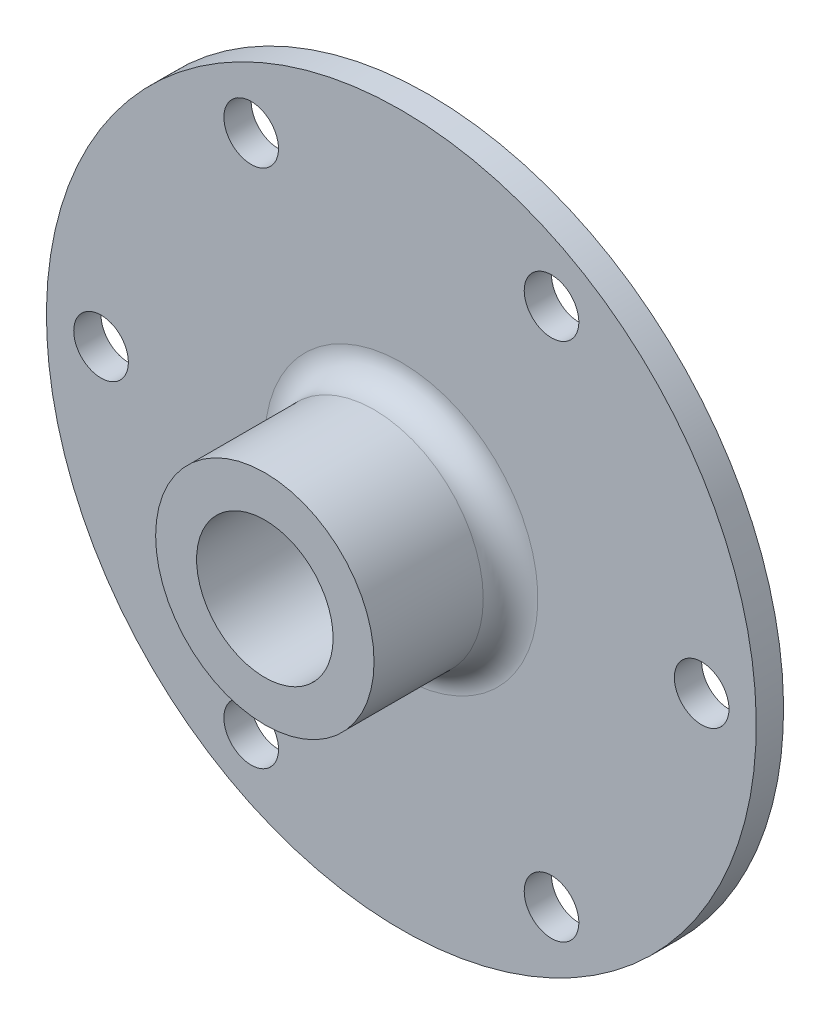
ISO-10303-21;
HEADER;
FILE_DESCRIPTION(('STEP AP214'),'2;1');
FILE_NAME('part.step','',(''),(''),'','','');
FILE_SCHEMA(('AUTOMOTIVE_DESIGN { 1 0 10303 214 1 1 1 1 }'));
ENDSEC;
DATA;
#1=APPLICATION_CONTEXT('core data for automotive mechanical design processes');
#2=APPLICATION_PROTOCOL_DEFINITION('international standard','automotive_design',2000,#1);
#3=PRODUCT_CONTEXT('',#1,'mechanical');
#4=PRODUCT('Part','Part','',(#3));
#5=PRODUCT_RELATED_PRODUCT_CATEGORY('part','',(#4));
#6=PRODUCT_DEFINITION_FORMATION('','',#4);
#7=PRODUCT_DEFINITION_CONTEXT('part definition',#1,'design');
#8=PRODUCT_DEFINITION('design','',#6,#7);
#9=PRODUCT_DEFINITION_SHAPE('','',#8);
#10=(LENGTH_UNIT() NAMED_UNIT(*) SI_UNIT(.MILLI.,.METRE.));
#11=(NAMED_UNIT(*) PLANE_ANGLE_UNIT() SI_UNIT($,.RADIAN.));
#12=(NAMED_UNIT(*) SI_UNIT($,.STERADIAN.) SOLID_ANGLE_UNIT());
#13=UNCERTAINTY_MEASURE_WITH_UNIT(LENGTH_MEASURE(1.E-05),#10,'distance_accuracy_value','');
#14=(GEOMETRIC_REPRESENTATION_CONTEXT(3) GLOBAL_UNCERTAINTY_ASSIGNED_CONTEXT((#13)) GLOBAL_UNIT_ASSIGNED_CONTEXT((#10,
#11,#12)) REPRESENTATION_CONTEXT('',''));
#15=CARTESIAN_POINT('',(0.,0.,0.));
#16=DIRECTION('',(0.,0.,1.));
#17=DIRECTION('',(1.,0.,0.));
#18=AXIS2_PLACEMENT_3D('',#15,#16,#17);
#19=CARTESIAN_POINT('',(0.,0.,19.05));
#20=DIRECTION('',(0.,0.,1.));
#21=DIRECTION('',(0.,-1.,0.));
#22=AXIS2_PLACEMENT_3D('',#19,#20,#21);
#23=PLANE('',#22);
#24=CARTESIAN_POINT('',(0.,0.,19.05));
#25=DIRECTION('',(0.,0.,1.));
#26=DIRECTION('',(1.,0.,0.));
#27=AXIS2_PLACEMENT_3D('',#24,#25,#26);
#28=CIRCLE('',#27,7.9375);
#29=CARTESIAN_POINT('',(7.9375,0.,19.05));
#30=VERTEX_POINT('',#29);
#31=EDGE_CURVE('E54',#30,#30,#28,.T.);
#32=ORIENTED_EDGE('',*,*,#31,.F.);
#33=EDGE_LOOP('',(#32));
#34=FACE_BOUND('',#33,.T.);
#35=CARTESIAN_POINT('',(0.,0.,19.05));
#36=DIRECTION('',(0.,0.,-1.));
#37=DIRECTION('',(0.,1.,0.));
#38=AXIS2_PLACEMENT_3D('',#35,#36,#37);
#39=CIRCLE('',#38,12.7);
#40=CARTESIAN_POINT('',(0.,12.7,19.05));
#41=VERTEX_POINT('',#40);
#42=EDGE_CURVE('E41',#41,#41,#39,.T.);
#43=ORIENTED_EDGE('',*,*,#42,.F.);
#44=EDGE_LOOP('',(#43));
#45=FACE_BOUND('',#44,.T.);
#46=ADVANCED_FACE('F30',(#34,#45),#23,.T.);
#47=CARTESIAN_POINT('',(0.,0.,0.));
#48=DIRECTION('',(0.,0.,-1.));
#49=DIRECTION('',(0.,1.,0.));
#50=AXIS2_PLACEMENT_3D('',#47,#48,#49);
#51=CYLINDRICAL_SURFACE('',#50,12.7);
#52=CARTESIAN_POINT('',(0.,0.,6.35));
#53=DIRECTION('',(0.,0.,1.));
#54=DIRECTION('',(0.,-1.,0.));
#55=AXIS2_PLACEMENT_3D('',#52,#53,#54);
#56=CIRCLE('',#55,12.7);
#57=CARTESIAN_POINT('',(0.,-12.7,6.34999999999999));
#58=VERTEX_POINT('',#57);
#59=EDGE_CURVE('E10',#58,#58,#56,.T.);
#60=ORIENTED_EDGE('',*,*,#59,.T.);
#61=EDGE_LOOP('',(#60));
#62=FACE_BOUND('',#61,.T.);
#63=ORIENTED_EDGE('',*,*,#42,.T.);
#64=EDGE_LOOP('',(#63));
#65=FACE_BOUND('',#64,.T.);
#66=ADVANCED_FACE('F111',(#62,#65),#51,.T.);
#67=CARTESIAN_POINT('',(0.,12.7,3.175));
#68=DIRECTION('',(0.,0.,1.));
#69=DIRECTION('',(0.,-1.,0.));
#70=AXIS2_PLACEMENT_3D('',#67,#68,#69);
#71=PLANE('',#70);
#72=CARTESIAN_POINT('',(0.,0.,3.175));
#73=DIRECTION('',(0.,0.,1.));
#74=DIRECTION('',(0.,-1.,0.));
#75=AXIS2_PLACEMENT_3D('',#72,#73,#74);
#76=CIRCLE('',#75,15.875);
#77=CARTESIAN_POINT('',(0.,-15.875,3.17499999999999));
#78=VERTEX_POINT('',#77);
#79=EDGE_CURVE('E37',#78,#78,#76,.F.);
#80=ORIENTED_EDGE('',*,*,#79,.T.);
#81=EDGE_LOOP('',(#80));
#82=FACE_BOUND('',#81,.T.);
#83=CARTESIAN_POINT('',(17.4625000000004,-30.2459372271713,3.17499999999999));
#84=DIRECTION('',(0.,0.,1.));
#85=DIRECTION('',(0.50000000000001,-0.866025403784433,0.));
#86=AXIS2_PLACEMENT_3D('',#83,#84,#85);
#87=CIRCLE('',#86,3.175);
#88=CARTESIAN_POINT('',(19.0500000000004,-32.9955678841869,3.17499999999999));
#89=VERTEX_POINT('',#88);
#90=EDGE_CURVE('E72',#89,#89,#87,.T.);
#91=ORIENTED_EDGE('',*,*,#90,.F.);
#92=EDGE_LOOP('',(#91));
#93=FACE_BOUND('',#92,.T.);
#94=CARTESIAN_POINT('',(-17.4624999999997,-30.2459372271717,3.17499999999999));
#95=DIRECTION('',(0.,0.,1.));
#96=DIRECTION('',(-0.499999999999992,-0.866025403784443,0.));
#97=AXIS2_PLACEMENT_3D('',#94,#95,#96);
#98=CIRCLE('',#97,3.175);
#99=CARTESIAN_POINT('',(-19.0499999999997,-32.9955678841873,3.17499999999999));
#100=VERTEX_POINT('',#99);
#101=EDGE_CURVE('E78',#100,#100,#98,.T.);
#102=ORIENTED_EDGE('',*,*,#101,.F.);
#103=EDGE_LOOP('',(#102));
#104=FACE_BOUND('',#103,.T.);
#105=CARTESIAN_POINT('',(-34.925,0.,3.175));
#106=DIRECTION('',(0.,0.,1.));
#107=DIRECTION('',(-1.,0.,0.));
#108=AXIS2_PLACEMENT_3D('',#105,#106,#107);
#109=CIRCLE('',#108,3.175);
#110=CARTESIAN_POINT('',(-38.1,0.,3.175));
#111=VERTEX_POINT('',#110);
#112=EDGE_CURVE('E84',#111,#111,#109,.T.);
#113=ORIENTED_EDGE('',*,*,#112,.F.);
#114=EDGE_LOOP('',(#113));
#115=FACE_BOUND('',#114,.T.);
#116=CARTESIAN_POINT('',(-17.4625000000001,30.2459372271714,3.175));
#117=DIRECTION('',(0.,0.,1.));
#118=DIRECTION('',(-0.500000000000004,0.866025403784436,0.));
#119=AXIS2_PLACEMENT_3D('',#116,#117,#118);
#120=CIRCLE('',#119,3.175);
#121=CARTESIAN_POINT('',(-19.0500000000002,32.995567884187,3.175));
#122=VERTEX_POINT('',#121);
#123=EDGE_CURVE('E90',#122,#122,#120,.T.);
#124=ORIENTED_EDGE('',*,*,#123,.F.);
#125=EDGE_LOOP('',(#124));
#126=FACE_BOUND('',#125,.T.);
#127=CARTESIAN_POINT('',(17.4624999999999,30.2459372271716,3.175));
#128=DIRECTION('',(0.,0.,1.));
#129=DIRECTION('',(0.499999999999998,0.86602540378444,0.));
#130=AXIS2_PLACEMENT_3D('',#127,#128,#129);
#131=CIRCLE('',#130,3.175);
#132=CARTESIAN_POINT('',(19.0499999999999,32.9955678841872,3.175));
#133=VERTEX_POINT('',#132);
#134=EDGE_CURVE('E66',#133,#133,#131,.T.);
#135=ORIENTED_EDGE('',*,*,#134,.F.);
#136=EDGE_LOOP('',(#135));
#137=FACE_BOUND('',#136,.T.);
#138=CARTESIAN_POINT('',(34.925,0.,3.175));
#139=DIRECTION('',(0.,0.,1.));
#140=DIRECTION('',(1.,0.,0.));
#141=AXIS2_PLACEMENT_3D('',#138,#139,#140);
#142=CIRCLE('',#141,3.175);
#143=CARTESIAN_POINT('',(38.1,0.,3.175));
#144=VERTEX_POINT('',#143);
#145=EDGE_CURVE('E60',#144,#144,#142,.T.);
#146=ORIENTED_EDGE('',*,*,#145,.F.);
#147=EDGE_LOOP('',(#146));
#148=FACE_BOUND('',#147,.T.);
#149=CARTESIAN_POINT('',(0.,0.,3.17499999999999));
#150=DIRECTION('',(0.,0.,-1.));
#151=DIRECTION('',(0.,1.,0.));
#152=AXIS2_PLACEMENT_3D('',#149,#150,#151);
#153=CIRCLE('',#152,41.275);
#154=CARTESIAN_POINT('',(0.,41.275,3.175));
#155=VERTEX_POINT('',#154);
#156=EDGE_CURVE('E45',#155,#155,#153,.T.);
#157=ORIENTED_EDGE('',*,*,#156,.F.);
#158=EDGE_LOOP('',(#157));
#159=FACE_BOUND('',#158,.T.);
#160=ADVANCED_FACE('F107',(#82,#93,#104,#115,#126,#137,#148,#159),#71,.T.);
#161=CARTESIAN_POINT('',(0.,0.,0.));
#162=DIRECTION('',(0.,0.,-1.));
#163=DIRECTION('',(0.,1.,0.));
#164=AXIS2_PLACEMENT_3D('',#161,#162,#163);
#165=CYLINDRICAL_SURFACE('',#164,41.275);
#166=ORIENTED_EDGE('',*,*,#156,.T.);
#167=EDGE_LOOP('',(#166));
#168=FACE_BOUND('',#167,.T.);
#169=CARTESIAN_POINT('',(0.,0.,0.));
#170=DIRECTION('',(0.,0.,-1.));
#171=DIRECTION('',(0.,1.,0.));
#172=AXIS2_PLACEMENT_3D('',#169,#170,#171);
#173=CIRCLE('',#172,41.275);
#174=CARTESIAN_POINT('',(0.,41.275,0.));
#175=VERTEX_POINT('',#174);
#176=EDGE_CURVE('E50',#175,#175,#173,.T.);
#177=ORIENTED_EDGE('',*,*,#176,.F.);
#178=EDGE_LOOP('',(#177));
#179=FACE_BOUND('',#178,.T.);
#180=ADVANCED_FACE('F110',(#168,#179),#165,.T.);
#181=CARTESIAN_POINT('',(0.,0.,0.));
#182=DIRECTION('',(0.,0.,-1.));
#183=DIRECTION('',(0.,1.,0.));
#184=AXIS2_PLACEMENT_3D('',#181,#182,#183);
#185=PLANE('',#184);
#186=CARTESIAN_POINT('',(17.4625000000004,-30.2459372271713,0.));
#187=DIRECTION('',(0.,0.,1.));
#188=DIRECTION('',(0.50000000000001,-0.866025403784433,0.));
#189=AXIS2_PLACEMENT_3D('',#186,#187,#188);
#190=CIRCLE('',#189,3.175);
#191=CARTESIAN_POINT('',(19.0500000000004,-32.9955678841869,0.));
#192=VERTEX_POINT('',#191);
#193=EDGE_CURVE('E75',#192,#192,#190,.T.);
#194=ORIENTED_EDGE('',*,*,#193,.T.);
#195=EDGE_LOOP('',(#194));
#196=FACE_BOUND('',#195,.T.);
#197=CARTESIAN_POINT('',(-17.4624999999997,-30.2459372271717,0.));
#198=DIRECTION('',(0.,0.,1.));
#199=DIRECTION('',(-0.499999999999992,-0.866025403784443,0.));
#200=AXIS2_PLACEMENT_3D('',#197,#198,#199);
#201=CIRCLE('',#200,3.175);
#202=CARTESIAN_POINT('',(-19.0499999999997,-32.9955678841873,0.));
#203=VERTEX_POINT('',#202);
#204=EDGE_CURVE('E81',#203,#203,#201,.T.);
#205=ORIENTED_EDGE('',*,*,#204,.T.);
#206=EDGE_LOOP('',(#205));
#207=FACE_BOUND('',#206,.T.);
#208=CARTESIAN_POINT('',(-34.925,0.,0.));
#209=DIRECTION('',(0.,0.,1.));
#210=DIRECTION('',(-1.,0.,0.));
#211=AXIS2_PLACEMENT_3D('',#208,#209,#210);
#212=CIRCLE('',#211,3.175);
#213=CARTESIAN_POINT('',(-38.1,0.,0.));
#214=VERTEX_POINT('',#213);
#215=EDGE_CURVE('E87',#214,#214,#212,.T.);
#216=ORIENTED_EDGE('',*,*,#215,.T.);
#217=EDGE_LOOP('',(#216));
#218=FACE_BOUND('',#217,.T.);
#219=CARTESIAN_POINT('',(-17.4625000000001,30.2459372271714,0.));
#220=DIRECTION('',(0.,0.,1.));
#221=DIRECTION('',(-0.500000000000004,0.866025403784436,0.));
#222=AXIS2_PLACEMENT_3D('',#219,#220,#221);
#223=CIRCLE('',#222,3.175);
#224=CARTESIAN_POINT('',(-19.0500000000002,32.995567884187,0.));
#225=VERTEX_POINT('',#224);
#226=EDGE_CURVE('E69',#225,#225,#223,.T.);
#227=ORIENTED_EDGE('',*,*,#226,.T.);
#228=EDGE_LOOP('',(#227));
#229=FACE_BOUND('',#228,.T.);
#230=CARTESIAN_POINT('',(17.4624999999999,30.2459372271716,0.));
#231=DIRECTION('',(0.,0.,1.));
#232=DIRECTION('',(0.499999999999998,0.86602540378444,0.));
#233=AXIS2_PLACEMENT_3D('',#230,#231,#232);
#234=CIRCLE('',#233,3.175);
#235=CARTESIAN_POINT('',(19.0499999999999,32.9955678841872,0.));
#236=VERTEX_POINT('',#235);
#237=EDGE_CURVE('E63',#236,#236,#234,.T.);
#238=ORIENTED_EDGE('',*,*,#237,.T.);
#239=EDGE_LOOP('',(#238));
#240=FACE_BOUND('',#239,.T.);
#241=CARTESIAN_POINT('',(34.925,0.,0.));
#242=DIRECTION('',(0.,0.,1.));
#243=DIRECTION('',(1.,0.,0.));
#244=AXIS2_PLACEMENT_3D('',#241,#242,#243);
#245=CIRCLE('',#244,3.175);
#246=CARTESIAN_POINT('',(38.1,0.,0.));
#247=VERTEX_POINT('',#246);
#248=EDGE_CURVE('E57',#247,#247,#245,.T.);
#249=ORIENTED_EDGE('',*,*,#248,.T.);
#250=EDGE_LOOP('',(#249));
#251=FACE_BOUND('',#250,.T.);
#252=CARTESIAN_POINT('',(0.,0.,0.));
#253=DIRECTION('',(0.,0.,1.));
#254=DIRECTION('',(1.,0.,0.));
#255=AXIS2_PLACEMENT_3D('',#252,#253,#254);
#256=CIRCLE('',#255,7.9375);
#257=CARTESIAN_POINT('',(7.9375,0.,0.));
#258=VERTEX_POINT('',#257);
#259=EDGE_CURVE('E53',#258,#258,#256,.T.);
#260=ORIENTED_EDGE('',*,*,#259,.T.);
#261=EDGE_LOOP('',(#260));
#262=FACE_BOUND('',#261,.T.);
#263=ORIENTED_EDGE('',*,*,#176,.T.);
#264=EDGE_LOOP('',(#263));
#265=FACE_BOUND('',#264,.T.);
#266=ADVANCED_FACE('F96',(#196,#207,#218,#229,#240,#251,#262,#265),#185,.T.);
#267=CARTESIAN_POINT('',(0.,0.,0.));
#268=DIRECTION('',(0.,0.,1.));
#269=DIRECTION('',(1.,0.,0.));
#270=AXIS2_PLACEMENT_3D('',#267,#268,#269);
#271=CYLINDRICAL_SURFACE('',#270,7.9375);
#272=CARTESIAN_POINT('',(7.9375,0.,0.));
#273=CARTESIAN_POINT('',(7.9375,0.,0.1984375));
#274=CARTESIAN_POINT('',(7.9375,0.,0.396875));
#275=CARTESIAN_POINT('',(7.9375,0.,0.79375));
#276=CARTESIAN_POINT('',(7.9375,0.,0.9921875));
#277=CARTESIAN_POINT('',(7.9375,0.,1.3890625));
#278=CARTESIAN_POINT('',(7.9375,0.,1.5875));
#279=CARTESIAN_POINT('',(7.9375,0.,1.984375));
#280=CARTESIAN_POINT('',(7.9375,0.,2.1828125));
#281=CARTESIAN_POINT('',(7.9375,0.,2.5796875));
#282=CARTESIAN_POINT('',(7.9375,0.,2.778125));
#283=CARTESIAN_POINT('',(7.9375,0.,3.175));
#284=CARTESIAN_POINT('',(7.9375,0.,3.3734375));
#285=CARTESIAN_POINT('',(7.9375,0.,3.7703125));
#286=CARTESIAN_POINT('',(7.9375,0.,3.96875));
#287=CARTESIAN_POINT('',(7.9375,0.,4.365625));
#288=CARTESIAN_POINT('',(7.9375,0.,4.5640625));
#289=CARTESIAN_POINT('',(7.9375,0.,4.9609375));
#290=CARTESIAN_POINT('',(7.9375,0.,5.159375));
#291=CARTESIAN_POINT('',(7.9375,0.,5.55625));
#292=CARTESIAN_POINT('',(7.9375,0.,5.7546875));
#293=CARTESIAN_POINT('',(7.9375,0.,6.1515625));
#294=CARTESIAN_POINT('',(7.9375,0.,6.35));
#295=CARTESIAN_POINT('',(7.9375,0.,6.746875));
#296=CARTESIAN_POINT('',(7.9375,0.,6.9453125));
#297=CARTESIAN_POINT('',(7.9375,0.,7.3421875));
#298=CARTESIAN_POINT('',(7.9375,0.,7.540625));
#299=CARTESIAN_POINT('',(7.9375,0.,7.9375));
#300=CARTESIAN_POINT('',(7.9375,0.,8.1359375));
#301=CARTESIAN_POINT('',(7.9375,0.,8.5328125));
#302=CARTESIAN_POINT('',(7.9375,0.,8.73125));
#303=CARTESIAN_POINT('',(7.9375,0.,9.128125));
#304=CARTESIAN_POINT('',(7.9375,0.,9.3265625));
#305=CARTESIAN_POINT('',(7.9375,0.,9.7234375));
#306=CARTESIAN_POINT('',(7.9375,0.,9.921875));
#307=CARTESIAN_POINT('',(7.9375,0.,10.31875));
#308=CARTESIAN_POINT('',(7.9375,0.,10.5171875));
#309=CARTESIAN_POINT('',(7.9375,0.,10.9140625));
#310=CARTESIAN_POINT('',(7.9375,0.,11.1125));
#311=CARTESIAN_POINT('',(7.9375,0.,11.509375));
#312=CARTESIAN_POINT('',(7.9375,0.,11.7078125));
#313=CARTESIAN_POINT('',(7.9375,0.,12.1046875));
#314=CARTESIAN_POINT('',(7.9375,0.,12.303125));
#315=CARTESIAN_POINT('',(7.9375,0.,12.7));
#316=CARTESIAN_POINT('',(7.9375,0.,12.8984375));
#317=CARTESIAN_POINT('',(7.9375,0.,13.2953125));
#318=CARTESIAN_POINT('',(7.9375,0.,13.49375));
#319=CARTESIAN_POINT('',(7.9375,0.,13.890625));
#320=CARTESIAN_POINT('',(7.9375,0.,14.0890625));
#321=CARTESIAN_POINT('',(7.9375,0.,14.4859375));
#322=CARTESIAN_POINT('',(7.9375,0.,14.684375));
#323=CARTESIAN_POINT('',(7.9375,0.,15.08125));
#324=CARTESIAN_POINT('',(7.9375,0.,15.2796875));
#325=CARTESIAN_POINT('',(7.9375,0.,15.6765625));
#326=CARTESIAN_POINT('',(7.9375,0.,15.875));
#327=CARTESIAN_POINT('',(7.9375,0.,16.271875));
#328=CARTESIAN_POINT('',(7.9375,0.,16.4703125));
#329=CARTESIAN_POINT('',(7.9375,0.,16.8671875));
#330=CARTESIAN_POINT('',(7.9375,0.,17.065625));
#331=CARTESIAN_POINT('',(7.9375,0.,17.4625));
#332=CARTESIAN_POINT('',(7.9375,0.,17.6609375));
#333=CARTESIAN_POINT('',(7.9375,0.,18.0578125));
#334=CARTESIAN_POINT('',(7.9375,0.,18.25625));
#335=CARTESIAN_POINT('',(7.9375,0.,18.653125));
#336=CARTESIAN_POINT('',(7.9375,0.,18.8515625));
#337=CARTESIAN_POINT('',(7.9375,0.,19.05));
#338=B_SPLINE_CURVE_WITH_KNOTS('',3,(#272,#273,#274,#275,#276,#277,#278,#279,#280,#281,#282,
#283,#284,#285,#286,#287,#288,#289,#290,#291,#292,#293,#294,#295,#296,#297,#298,#299,#300,#301,
#302,#303,#304,#305,#306,#307,#308,#309,#310,#311,#312,#313,#314,#315,#316,#317,#318,#319,#320,
#321,#322,#323,#324,#325,#326,#327,#328,#329,#330,#331,#332,#333,#334,#335,#336,#337),
.UNSPECIFIED.,.F.,.F.,(4,2,2,2,2,2,2,2,2,2,2,2,2,2,2,2,2,2,2,2,2,2,2,2,2,2,2,2,2,2,2,2,4),(0.,
0.5953125,1.190625,1.7859375,2.38125,2.9765625,3.571875,4.1671875,4.7625,5.3578125,5.953125,
6.5484375,7.14375,7.7390625,8.334375,8.9296875,9.525,10.1203125,10.715625,11.3109375,11.90625,
12.5015625,13.096875,13.6921875,14.2875,14.8828125,15.478125,16.0734375,16.66875,17.2640625,
17.859375,18.4546875,19.05),.UNSPECIFIED.);
#339=EDGE_CURVE('BSEAM125',#258,#30,#338,.T.);
#340=ORIENTED_EDGE('',*,*,#259,.F.);
#341=ORIENTED_EDGE('',*,*,#31,.T.);
#342=ORIENTED_EDGE('',*,*,#339,.T.);
#343=ORIENTED_EDGE('',*,*,#339,.F.);
#344=EDGE_LOOP('',(#340,#342,#341,#343));
#345=FACE_BOUND('',#344,.T.);
#346=ADVANCED_FACE('F125',(#345),#271,.F.);
#347=CARTESIAN_POINT('',(34.925,0.,0.));
#348=DIRECTION('',(0.,0.,1.));
#349=DIRECTION('',(1.,0.,0.));
#350=AXIS2_PLACEMENT_3D('',#347,#348,#349);
#351=CYLINDRICAL_SURFACE('',#350,3.175);
#352=ORIENTED_EDGE('',*,*,#248,.F.);
#353=EDGE_LOOP('',(#352));
#354=FACE_BOUND('',#353,.T.);
#355=ORIENTED_EDGE('',*,*,#145,.T.);
#356=EDGE_LOOP('',(#355));
#357=FACE_BOUND('',#356,.T.);
#358=ADVANCED_FACE('F131',(#354,#357),#351,.F.);
#359=CARTESIAN_POINT('',(17.4624999999999,30.2459372271716,0.));
#360=DIRECTION('',(0.,0.,1.));
#361=DIRECTION('',(1.,0.,0.));
#362=AXIS2_PLACEMENT_3D('',#359,#360,#361);
#363=CYLINDRICAL_SURFACE('',#362,3.175);
#364=ORIENTED_EDGE('',*,*,#237,.F.);
#365=EDGE_LOOP('',(#364));
#366=FACE_BOUND('',#365,.T.);
#367=ORIENTED_EDGE('',*,*,#134,.T.);
#368=EDGE_LOOP('',(#367));
#369=FACE_BOUND('',#368,.T.);
#370=ADVANCED_FACE('F103',(#366,#369),#363,.F.);
#371=CARTESIAN_POINT('',(-17.4625000000001,30.2459372271714,0.));
#372=DIRECTION('',(0.,0.,1.));
#373=DIRECTION('',(0.,-1.,0.));
#374=AXIS2_PLACEMENT_3D('',#371,#372,#373);
#375=CYLINDRICAL_SURFACE('',#374,3.175);
#376=ORIENTED_EDGE('',*,*,#226,.F.);
#377=EDGE_LOOP('',(#376));
#378=FACE_BOUND('',#377,.T.);
#379=ORIENTED_EDGE('',*,*,#123,.T.);
#380=EDGE_LOOP('',(#379));
#381=FACE_BOUND('',#380,.T.);
#382=ADVANCED_FACE('F99',(#378,#381),#375,.F.);
#383=CARTESIAN_POINT('',(-34.925,0.,0.));
#384=DIRECTION('',(0.,0.,1.));
#385=DIRECTION('',(0.,-1.,0.));
#386=AXIS2_PLACEMENT_3D('',#383,#384,#385);
#387=CYLINDRICAL_SURFACE('',#386,3.175);
#388=ORIENTED_EDGE('',*,*,#215,.F.);
#389=EDGE_LOOP('',(#388));
#390=FACE_BOUND('',#389,.T.);
#391=ORIENTED_EDGE('',*,*,#112,.T.);
#392=EDGE_LOOP('',(#391));
#393=FACE_BOUND('',#392,.T.);
#394=ADVANCED_FACE('F102',(#390,#393),#387,.F.);
#395=CARTESIAN_POINT('',(-17.4624999999997,-30.2459372271717,0.));
#396=DIRECTION('',(0.,0.,1.));
#397=DIRECTION('',(0.,-1.,0.));
#398=AXIS2_PLACEMENT_3D('',#395,#396,#397);
#399=CYLINDRICAL_SURFACE('',#398,3.175);
#400=ORIENTED_EDGE('',*,*,#204,.F.);
#401=EDGE_LOOP('',(#400));
#402=FACE_BOUND('',#401,.T.);
#403=ORIENTED_EDGE('',*,*,#101,.T.);
#404=EDGE_LOOP('',(#403));
#405=FACE_BOUND('',#404,.T.);
#406=ADVANCED_FACE('F205',(#402,#405),#399,.F.);
#407=CARTESIAN_POINT('',(17.4625000000004,-30.2459372271713,0.));
#408=DIRECTION('',(0.,0.,1.));
#409=DIRECTION('',(1.,0.,0.));
#410=AXIS2_PLACEMENT_3D('',#407,#408,#409);
#411=CYLINDRICAL_SURFACE('',#410,3.175);
#412=ORIENTED_EDGE('',*,*,#193,.F.);
#413=EDGE_LOOP('',(#412));
#414=FACE_BOUND('',#413,.T.);
#415=ORIENTED_EDGE('',*,*,#90,.T.);
#416=EDGE_LOOP('',(#415));
#417=FACE_BOUND('',#416,.T.);
#418=ADVANCED_FACE('F214',(#414,#417),#411,.F.);
#419=CARTESIAN_POINT('',(0.,0.,6.35));
#420=DIRECTION('',(0.,0.,1.));
#421=DIRECTION('',(0.,-1.,0.));
#422=AXIS2_PLACEMENT_3D('',#419,#420,#421);
#423=TOROIDAL_SURFACE('',#422,15.875,3.175);
#424=ORIENTED_EDGE('',*,*,#59,.F.);
#425=EDGE_LOOP('',(#424));
#426=FACE_BOUND('',#425,.T.);
#427=ORIENTED_EDGE('',*,*,#79,.F.);
#428=EDGE_LOOP('',(#427));
#429=FACE_BOUND('',#428,.T.);
#430=ADVANCED_FACE('F32',(#426,#429),#423,.F.);
#431=CLOSED_SHELL('',(#46,#66,#160,#180,#266,#346,#358,#370,#382,#394,#406,#418,#430));
#432=MANIFOLD_SOLID_BREP('B2',#431);
#433=ADVANCED_BREP_SHAPE_REPRESENTATION('',(#18,#432),#14);
#434=SHAPE_DEFINITION_REPRESENTATION(#9,#433);
ENDSEC;
END-ISO-10303-21;
